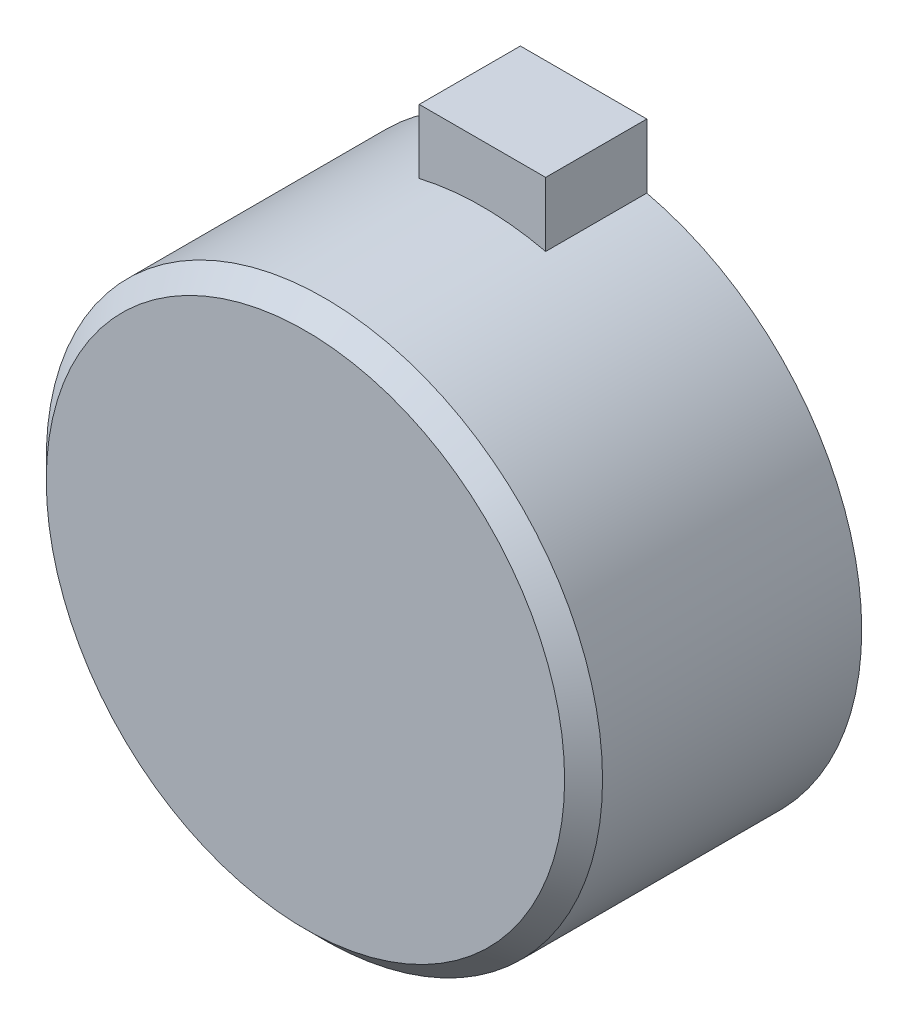
ISO-10303-21;
HEADER;
FILE_DESCRIPTION(('STEP AP214'),'2;1');
FILE_NAME('part.step','',(''),(''),'','','');
FILE_SCHEMA(('AUTOMOTIVE_DESIGN { 1 0 10303 214 1 1 1 1 }'));
ENDSEC;
DATA;
#1=APPLICATION_CONTEXT('core data for automotive mechanical design processes');
#2=APPLICATION_PROTOCOL_DEFINITION('international standard','automotive_design',2000,#1);
#3=PRODUCT_CONTEXT('',#1,'mechanical');
#4=PRODUCT('Part','Part','',(#3));
#5=PRODUCT_RELATED_PRODUCT_CATEGORY('part','',(#4));
#6=PRODUCT_DEFINITION_FORMATION('','',#4);
#7=PRODUCT_DEFINITION_CONTEXT('part definition',#1,'design');
#8=PRODUCT_DEFINITION('design','',#6,#7);
#9=PRODUCT_DEFINITION_SHAPE('','',#8);
#10=(LENGTH_UNIT() NAMED_UNIT(*) SI_UNIT(.MILLI.,.METRE.));
#11=(NAMED_UNIT(*) PLANE_ANGLE_UNIT() SI_UNIT($,.RADIAN.));
#12=(NAMED_UNIT(*) SI_UNIT($,.STERADIAN.) SOLID_ANGLE_UNIT());
#13=UNCERTAINTY_MEASURE_WITH_UNIT(LENGTH_MEASURE(1.E-05),#10,'distance_accuracy_value','');
#14=(GEOMETRIC_REPRESENTATION_CONTEXT(3) GLOBAL_UNCERTAINTY_ASSIGNED_CONTEXT((#13)) GLOBAL_UNIT_ASSIGNED_CONTEXT((#10,
#11,#12)) REPRESENTATION_CONTEXT('',''));
#15=CARTESIAN_POINT('',(0.,0.,0.));
#16=DIRECTION('',(0.,0.,1.));
#17=DIRECTION('',(1.,0.,0.));
#18=AXIS2_PLACEMENT_3D('',#15,#16,#17);
#19=CARTESIAN_POINT('',(0.,0.,10.));
#20=DIRECTION('',(0.,0.,1.));
#21=DIRECTION('',(1.,0.,0.));
#22=AXIS2_PLACEMENT_3D('',#19,#20,#21);
#23=CYLINDRICAL_SURFACE('',#22,44.);
#24=CARTESIAN_POINT('',(0.,0.,-3.));
#25=DIRECTION('',(0.,0.,1.));
#26=DIRECTION('',(1.,0.,0.));
#27=AXIS2_PLACEMENT_3D('',#24,#25,#26);
#28=CIRCLE('',#27,44.);
#29=CARTESIAN_POINT('',(44.,0.,-3.));
#30=VERTEX_POINT('',#29);
#31=EDGE_CURVE('E149',#30,#30,#28,.T.);
#32=ORIENTED_EDGE('',*,*,#31,.F.);
#33=EDGE_LOOP('',(#32));
#34=FACE_BOUND('',#33,.T.);
#35=CARTESIAN_POINT('',(0.,0.,-28.));
#36=DIRECTION('',(0.,0.,1.));
#37=DIRECTION('',(1.,0.,0.));
#38=AXIS2_PLACEMENT_3D('',#35,#36,#37);
#39=CIRCLE('',#38,44.);
#40=CARTESIAN_POINT('',(-10.,42.8485705712571,-28.));
#41=VERTEX_POINT('',#40);
#42=CARTESIAN_POINT('',(10.,42.8485705712571,-28.));
#43=VERTEX_POINT('',#42);
#44=EDGE_CURVE('E11',#41,#43,#39,.F.);
#45=ORIENTED_EDGE('',*,*,#44,.F.);
#46=DIRECTION('',(0.,0.,1.));
#47=VECTOR('',#46,1.);
#48=CARTESIAN_POINT('',(-10.,42.8485705712571,10.));
#49=LINE('',#48,#47);
#50=CARTESIAN_POINT('',(-10.,42.8485705712571,-44.));
#51=VERTEX_POINT('',#50);
#52=EDGE_CURVE('E57',#41,#51,#49,.F.);
#53=ORIENTED_EDGE('',*,*,#52,.T.);
#54=CARTESIAN_POINT('',(0.,0.,-44.));
#55=DIRECTION('',(0.,0.,1.));
#56=DIRECTION('',(1.,0.,0.));
#57=AXIS2_PLACEMENT_3D('',#54,#55,#56);
#58=CIRCLE('',#57,44.);
#59=CARTESIAN_POINT('',(10.,42.8485705712571,-44.));
#60=VERTEX_POINT('',#59);
#61=EDGE_CURVE('E144',#51,#60,#58,.T.);
#62=ORIENTED_EDGE('',*,*,#61,.T.);
#63=DIRECTION('',(0.,0.,1.));
#64=VECTOR('',#63,1.);
#65=CARTESIAN_POINT('',(10.,42.8485705712571,10.));
#66=LINE('',#65,#64);
#67=EDGE_CURVE('E91',#60,#43,#66,.T.);
#68=ORIENTED_EDGE('',*,*,#67,.T.);
#69=EDGE_LOOP('',(#45,#53,#62,#68));
#70=FACE_BOUND('',#69,.T.);
#71=ADVANCED_FACE('F39',(#34,#70),#23,.T.);
#72=CARTESIAN_POINT('',(0.,0.,0.));
#73=DIRECTION('',(0.,0.,1.));
#74=DIRECTION('',(1.,0.,0.));
#75=AXIS2_PLACEMENT_3D('',#72,#73,#74);
#76=PLANE('',#75);
#77=CARTESIAN_POINT('',(0.,0.,0.));
#78=DIRECTION('',(0.,0.,1.));
#79=DIRECTION('',(1.,0.,0.));
#80=AXIS2_PLACEMENT_3D('',#77,#78,#79);
#81=CIRCLE('',#80,41.);
#82=CARTESIAN_POINT('',(41.,0.,0.));
#83=VERTEX_POINT('',#82);
#84=EDGE_CURVE('E50',#83,#83,#81,.T.);
#85=ORIENTED_EDGE('',*,*,#84,.T.);
#86=EDGE_LOOP('',(#85));
#87=FACE_BOUND('',#86,.T.);
#88=ADVANCED_FACE('F41',(#87),#76,.T.);
#89=CARTESIAN_POINT('',(0.,0.,0.));
#90=DIRECTION('',(0.,0.,-1.));
#91=DIRECTION('',(-1.,0.,0.));
#92=AXIS2_PLACEMENT_3D('',#89,#90,#91);
#93=CONICAL_SURFACE('',#92,41.,0.785398163397449);
#94=ORIENTED_EDGE('',*,*,#31,.T.);
#95=EDGE_LOOP('',(#94));
#96=FACE_BOUND('',#95,.T.);
#97=ORIENTED_EDGE('',*,*,#84,.F.);
#98=EDGE_LOOP('',(#97));
#99=FACE_BOUND('',#98,.T.);
#100=ADVANCED_FACE('F154',(#96,#99),#93,.T.);
#101=CARTESIAN_POINT('',(41.,0.,-44.));
#102=DIRECTION('',(0.,0.,-1.));
#103=DIRECTION('',(-1.,0.,0.));
#104=AXIS2_PLACEMENT_3D('',#101,#102,#103);
#105=PLANE('',#104);
#106=ORIENTED_EDGE('',*,*,#61,.F.);
#107=DIRECTION('',(0.,-1.,0.));
#108=VECTOR('',#107,1.);
#109=CARTESIAN_POINT('',(-10.,53.,-44.));
#110=LINE('',#109,#108);
#111=CARTESIAN_POINT('',(-10.,53.,-44.));
#112=VERTEX_POINT('',#111);
#113=EDGE_CURVE('E103',#112,#51,#110,.T.);
#114=ORIENTED_EDGE('',*,*,#113,.F.);
#115=DIRECTION('',(-1.,0.,0.));
#116=VECTOR('',#115,1.);
#117=CARTESIAN_POINT('',(10.,53.,-44.));
#118=LINE('',#117,#116);
#119=CARTESIAN_POINT('',(10.,53.,-44.));
#120=VERTEX_POINT('',#119);
#121=EDGE_CURVE('E110',#120,#112,#118,.T.);
#122=ORIENTED_EDGE('',*,*,#121,.F.);
#123=DIRECTION('',(0.,1.,0.));
#124=VECTOR('',#123,1.);
#125=CARTESIAN_POINT('',(10.,40.,-44.));
#126=LINE('',#125,#124);
#127=EDGE_CURVE('E89',#60,#120,#126,.T.);
#128=ORIENTED_EDGE('',*,*,#127,.F.);
#129=EDGE_LOOP('',(#106,#114,#122,#128));
#130=FACE_BOUND('',#129,.T.);
#131=CARTESIAN_POINT('',(18.5,-32.0429399400242,-44.));
#132=DIRECTION('',(0.,0.,1.));
#133=DIRECTION('',(0.499999999999999,-0.866025403784439,0.));
#134=AXIS2_PLACEMENT_3D('',#131,#132,#133);
#135=CIRCLE('',#134,1.25);
#136=CARTESIAN_POINT('',(19.125,-33.1254716947548,-44.));
#137=VERTEX_POINT('',#136);
#138=EDGE_CURVE('E112',#137,#137,#135,.T.);
#139=ORIENTED_EDGE('',*,*,#138,.T.);
#140=EDGE_LOOP('',(#139));
#141=FACE_BOUND('',#140,.T.);
#142=CARTESIAN_POINT('',(-18.5,-32.0429399400242,-44.));
#143=DIRECTION('',(0.,0.,1.));
#144=DIRECTION('',(-0.5,-0.866025403784438,0.));
#145=AXIS2_PLACEMENT_3D('',#142,#143,#144);
#146=CIRCLE('',#145,1.25);
#147=CARTESIAN_POINT('',(-19.125,-33.1254716947548,-44.));
#148=VERTEX_POINT('',#147);
#149=EDGE_CURVE('E126',#148,#148,#146,.T.);
#150=ORIENTED_EDGE('',*,*,#149,.T.);
#151=EDGE_LOOP('',(#150));
#152=FACE_BOUND('',#151,.T.);
#153=CARTESIAN_POINT('',(-37.,0.,-44.));
#154=DIRECTION('',(0.,0.,1.));
#155=DIRECTION('',(-1.,0.,0.));
#156=AXIS2_PLACEMENT_3D('',#153,#154,#155);
#157=CIRCLE('',#156,1.25);
#158=CARTESIAN_POINT('',(-38.25,0.,-44.));
#159=VERTEX_POINT('',#158);
#160=EDGE_CURVE('E122',#159,#159,#157,.T.);
#161=ORIENTED_EDGE('',*,*,#160,.T.);
#162=EDGE_LOOP('',(#161));
#163=FACE_BOUND('',#162,.T.);
#164=CARTESIAN_POINT('',(-18.5,32.0429399400242,-44.));
#165=DIRECTION('',(0.,0.,1.));
#166=DIRECTION('',(-0.5,0.866025403784439,0.));
#167=AXIS2_PLACEMENT_3D('',#164,#165,#166);
#168=CIRCLE('',#167,1.25);
#169=CARTESIAN_POINT('',(-19.125,33.1254716947548,-44.));
#170=VERTEX_POINT('',#169);
#171=EDGE_CURVE('E119',#170,#170,#168,.T.);
#172=ORIENTED_EDGE('',*,*,#171,.T.);
#173=EDGE_LOOP('',(#172));
#174=FACE_BOUND('',#173,.T.);
#175=CARTESIAN_POINT('',(18.5,32.0429399400242,-44.));
#176=DIRECTION('',(0.,0.,1.));
#177=DIRECTION('',(0.5,0.866025403784439,0.));
#178=AXIS2_PLACEMENT_3D('',#175,#176,#177);
#179=CIRCLE('',#178,1.25);
#180=CARTESIAN_POINT('',(19.125,33.1254716947548,-44.));
#181=VERTEX_POINT('',#180);
#182=EDGE_CURVE('E113',#181,#181,#179,.T.);
#183=ORIENTED_EDGE('',*,*,#182,.T.);
#184=EDGE_LOOP('',(#183));
#185=FACE_BOUND('',#184,.T.);
#186=CARTESIAN_POINT('',(37.,0.,-44.));
#187=DIRECTION('',(0.,0.,1.));
#188=DIRECTION('',(1.,0.,0.));
#189=AXIS2_PLACEMENT_3D('',#186,#187,#188);
#190=CIRCLE('',#189,1.25);
#191=CARTESIAN_POINT('',(38.25,0.,-44.));
#192=VERTEX_POINT('',#191);
#193=EDGE_CURVE('E138',#192,#192,#190,.T.);
#194=ORIENTED_EDGE('',*,*,#193,.T.);
#195=EDGE_LOOP('',(#194));
#196=FACE_BOUND('',#195,.T.);
#197=ADVANCED_FACE('F160',(#130,#141,#152,#163,#174,#185,#196),#105,.T.);
#198=CARTESIAN_POINT('',(37.,0.,-36.));
#199=DIRECTION('',(0.,0.,-1.));
#200=DIRECTION('',(-1.,0.,0.));
#201=AXIS2_PLACEMENT_3D('',#198,#199,#200);
#202=CYLINDRICAL_SURFACE('',#201,1.25);
#203=CARTESIAN_POINT('',(37.,0.,-36.));
#204=DIRECTION('',(0.,0.,1.));
#205=DIRECTION('',(1.,0.,0.));
#206=AXIS2_PLACEMENT_3D('',#203,#204,#205);
#207=CIRCLE('',#206,1.25);
#208=CARTESIAN_POINT('',(38.25,0.,-36.));
#209=VERTEX_POINT('',#208);
#210=EDGE_CURVE('E142',#209,#209,#207,.T.);
#211=ORIENTED_EDGE('',*,*,#210,.T.);
#212=EDGE_LOOP('',(#211));
#213=FACE_BOUND('',#212,.T.);
#214=ORIENTED_EDGE('',*,*,#193,.F.);
#215=EDGE_LOOP('',(#214));
#216=FACE_BOUND('',#215,.T.);
#217=ADVANCED_FACE('F163',(#213,#216),#202,.F.);
#218=CARTESIAN_POINT('',(37.,0.,-36.));
#219=DIRECTION('',(0.,0.,1.));
#220=DIRECTION('',(1.,0.,0.));
#221=AXIS2_PLACEMENT_3D('',#218,#219,#220);
#222=PLANE('',#221);
#223=ORIENTED_EDGE('',*,*,#210,.F.);
#224=EDGE_LOOP('',(#223));
#225=FACE_BOUND('',#224,.T.);
#226=ADVANCED_FACE('F176',(#225),#222,.F.);
#227=CARTESIAN_POINT('',(18.5,32.0429399400242,-36.));
#228=DIRECTION('',(0.,0.,-1.));
#229=DIRECTION('',(-1.,0.,0.));
#230=AXIS2_PLACEMENT_3D('',#227,#228,#229);
#231=CYLINDRICAL_SURFACE('',#230,1.25);
#232=CARTESIAN_POINT('',(18.5,32.0429399400242,-36.));
#233=DIRECTION('',(0.,0.,1.));
#234=DIRECTION('',(0.5,0.866025403784439,0.));
#235=AXIS2_PLACEMENT_3D('',#232,#233,#234);
#236=CIRCLE('',#235,1.25);
#237=CARTESIAN_POINT('',(19.125,33.1254716947548,-36.));
#238=VERTEX_POINT('',#237);
#239=EDGE_CURVE('E136',#238,#238,#236,.T.);
#240=ORIENTED_EDGE('',*,*,#239,.T.);
#241=EDGE_LOOP('',(#240));
#242=FACE_BOUND('',#241,.T.);
#243=ORIENTED_EDGE('',*,*,#182,.F.);
#244=EDGE_LOOP('',(#243));
#245=FACE_BOUND('',#244,.T.);
#246=ADVANCED_FACE('F180',(#242,#245),#231,.F.);
#247=CARTESIAN_POINT('',(18.5,32.0429399400242,-36.));
#248=DIRECTION('',(0.,0.,1.));
#249=DIRECTION('',(0.5,0.866025403784439,0.));
#250=AXIS2_PLACEMENT_3D('',#247,#248,#249);
#251=PLANE('',#250);
#252=ORIENTED_EDGE('',*,*,#239,.F.);
#253=EDGE_LOOP('',(#252));
#254=FACE_BOUND('',#253,.T.);
#255=ADVANCED_FACE('F184',(#254),#251,.F.);
#256=CARTESIAN_POINT('',(-18.5,32.0429399400242,-36.));
#257=DIRECTION('',(0.,0.,-1.));
#258=DIRECTION('',(-1.,0.,0.));
#259=AXIS2_PLACEMENT_3D('',#256,#257,#258);
#260=CYLINDRICAL_SURFACE('',#259,1.25);
#261=CARTESIAN_POINT('',(-18.5,32.0429399400242,-36.));
#262=DIRECTION('',(0.,0.,1.));
#263=DIRECTION('',(-0.5,0.866025403784439,0.));
#264=AXIS2_PLACEMENT_3D('',#261,#262,#263);
#265=CIRCLE('',#264,1.25);
#266=CARTESIAN_POINT('',(-19.125,33.1254716947548,-36.));
#267=VERTEX_POINT('',#266);
#268=EDGE_CURVE('E115',#267,#267,#265,.T.);
#269=ORIENTED_EDGE('',*,*,#268,.T.);
#270=EDGE_LOOP('',(#269));
#271=FACE_BOUND('',#270,.T.);
#272=ORIENTED_EDGE('',*,*,#171,.F.);
#273=EDGE_LOOP('',(#272));
#274=FACE_BOUND('',#273,.T.);
#275=ADVANCED_FACE('F190',(#271,#274),#260,.F.);
#276=CARTESIAN_POINT('',(-18.5,32.0429399400242,-36.));
#277=DIRECTION('',(0.,0.,1.));
#278=DIRECTION('',(-0.5,0.866025403784439,0.));
#279=AXIS2_PLACEMENT_3D('',#276,#277,#278);
#280=PLANE('',#279);
#281=ORIENTED_EDGE('',*,*,#268,.F.);
#282=EDGE_LOOP('',(#281));
#283=FACE_BOUND('',#282,.T.);
#284=ADVANCED_FACE('F209',(#283),#280,.F.);
#285=CARTESIAN_POINT('',(-37.,0.,-36.));
#286=DIRECTION('',(0.,0.,-1.));
#287=DIRECTION('',(-1.,0.,0.));
#288=AXIS2_PLACEMENT_3D('',#285,#286,#287);
#289=CYLINDRICAL_SURFACE('',#288,1.25);
#290=CARTESIAN_POINT('',(-37.,0.,-36.));
#291=DIRECTION('',(0.,0.,1.));
#292=DIRECTION('',(-1.,0.,0.));
#293=AXIS2_PLACEMENT_3D('',#290,#291,#292);
#294=CIRCLE('',#293,1.25);
#295=CARTESIAN_POINT('',(-38.25,0.,-36.));
#296=VERTEX_POINT('',#295);
#297=EDGE_CURVE('E118',#296,#296,#294,.T.);
#298=ORIENTED_EDGE('',*,*,#297,.T.);
#299=EDGE_LOOP('',(#298));
#300=FACE_BOUND('',#299,.T.);
#301=ORIENTED_EDGE('',*,*,#160,.F.);
#302=EDGE_LOOP('',(#301));
#303=FACE_BOUND('',#302,.T.);
#304=ADVANCED_FACE('F210',(#300,#303),#289,.F.);
#305=CARTESIAN_POINT('',(-37.,0.,-36.));
#306=DIRECTION('',(0.,0.,1.));
#307=DIRECTION('',(-1.,0.,0.));
#308=AXIS2_PLACEMENT_3D('',#305,#306,#307);
#309=PLANE('',#308);
#310=ORIENTED_EDGE('',*,*,#297,.F.);
#311=EDGE_LOOP('',(#310));
#312=FACE_BOUND('',#311,.T.);
#313=ADVANCED_FACE('F205',(#312),#309,.F.);
#314=CARTESIAN_POINT('',(-18.5,-32.0429399400242,-36.));
#315=DIRECTION('',(0.,0.,-1.));
#316=DIRECTION('',(-1.,0.,0.));
#317=AXIS2_PLACEMENT_3D('',#314,#315,#316);
#318=CYLINDRICAL_SURFACE('',#317,1.25);
#319=CARTESIAN_POINT('',(-18.5,-32.0429399400242,-36.));
#320=DIRECTION('',(0.,0.,1.));
#321=DIRECTION('',(-0.5,-0.866025403784438,0.));
#322=AXIS2_PLACEMENT_3D('',#319,#320,#321);
#323=CIRCLE('',#322,1.25);
#324=CARTESIAN_POINT('',(-19.125,-33.1254716947548,-36.));
#325=VERTEX_POINT('',#324);
#326=EDGE_CURVE('E125',#325,#325,#323,.T.);
#327=ORIENTED_EDGE('',*,*,#326,.T.);
#328=EDGE_LOOP('',(#327));
#329=FACE_BOUND('',#328,.T.);
#330=ORIENTED_EDGE('',*,*,#149,.F.);
#331=EDGE_LOOP('',(#330));
#332=FACE_BOUND('',#331,.T.);
#333=ADVANCED_FACE('F200',(#329,#332),#318,.F.);
#334=CARTESIAN_POINT('',(-18.5,-32.0429399400242,-36.));
#335=DIRECTION('',(0.,0.,1.));
#336=DIRECTION('',(-0.5,-0.866025403784438,0.));
#337=AXIS2_PLACEMENT_3D('',#334,#335,#336);
#338=PLANE('',#337);
#339=ORIENTED_EDGE('',*,*,#326,.F.);
#340=EDGE_LOOP('',(#339));
#341=FACE_BOUND('',#340,.T.);
#342=ADVANCED_FACE('F193',(#341),#338,.F.);
#343=CARTESIAN_POINT('',(18.5,-32.0429399400242,-36.));
#344=DIRECTION('',(0.,0.,-1.));
#345=DIRECTION('',(-1.,0.,0.));
#346=AXIS2_PLACEMENT_3D('',#343,#344,#345);
#347=CYLINDRICAL_SURFACE('',#346,1.25);
#348=CARTESIAN_POINT('',(18.5,-32.0429399400242,-36.));
#349=DIRECTION('',(0.,0.,1.));
#350=DIRECTION('',(0.499999999999999,-0.866025403784439,0.));
#351=AXIS2_PLACEMENT_3D('',#348,#349,#350);
#352=CIRCLE('',#351,1.25);
#353=CARTESIAN_POINT('',(19.125,-33.1254716947548,-36.));
#354=VERTEX_POINT('',#353);
#355=EDGE_CURVE('E134',#354,#354,#352,.T.);
#356=ORIENTED_EDGE('',*,*,#355,.T.);
#357=EDGE_LOOP('',(#356));
#358=FACE_BOUND('',#357,.T.);
#359=ORIENTED_EDGE('',*,*,#138,.F.);
#360=EDGE_LOOP('',(#359));
#361=FACE_BOUND('',#360,.T.);
#362=ADVANCED_FACE('F187',(#358,#361),#347,.F.);
#363=CARTESIAN_POINT('',(18.5,-32.0429399400242,-36.));
#364=DIRECTION('',(0.,0.,1.));
#365=DIRECTION('',(0.499999999999999,-0.866025403784439,0.));
#366=AXIS2_PLACEMENT_3D('',#363,#364,#365);
#367=PLANE('',#366);
#368=ORIENTED_EDGE('',*,*,#355,.F.);
#369=EDGE_LOOP('',(#368));
#370=FACE_BOUND('',#369,.T.);
#371=ADVANCED_FACE('F194',(#370),#367,.F.);
#372=CARTESIAN_POINT('',(-10.,53.,-28.));
#373=DIRECTION('',(1.,0.,0.));
#374=DIRECTION('',(0.,0.,-1.));
#375=AXIS2_PLACEMENT_3D('',#372,#373,#374);
#376=PLANE('',#375);
#377=ORIENTED_EDGE('',*,*,#52,.F.);
#378=DIRECTION('',(0.,-1.,0.));
#379=VECTOR('',#378,1.);
#380=CARTESIAN_POINT('',(-10.,53.,-28.));
#381=LINE('',#380,#379);
#382=CARTESIAN_POINT('',(-10.,53.,-28.));
#383=VERTEX_POINT('',#382);
#384=EDGE_CURVE('E83',#383,#41,#381,.T.);
#385=ORIENTED_EDGE('',*,*,#384,.F.);
#386=DIRECTION('',(0.,0.,-1.));
#387=VECTOR('',#386,1.);
#388=CARTESIAN_POINT('',(-10.,53.,-28.));
#389=LINE('',#388,#387);
#390=EDGE_CURVE('E94',#383,#112,#389,.T.);
#391=ORIENTED_EDGE('',*,*,#390,.T.);
#392=ORIENTED_EDGE('',*,*,#113,.T.);
#393=EDGE_LOOP('',(#377,#385,#391,#392));
#394=FACE_BOUND('',#393,.T.);
#395=ADVANCED_FACE('F197',(#394),#376,.F.);
#396=CARTESIAN_POINT('',(10.,40.,-28.));
#397=DIRECTION('',(-1.,0.,0.));
#398=DIRECTION('',(0.,0.,1.));
#399=AXIS2_PLACEMENT_3D('',#396,#397,#398);
#400=PLANE('',#399);
#401=ORIENTED_EDGE('',*,*,#67,.F.);
#402=ORIENTED_EDGE('',*,*,#127,.T.);
#403=DIRECTION('',(0.,0.,-1.));
#404=VECTOR('',#403,1.);
#405=CARTESIAN_POINT('',(10.,53.,-28.));
#406=LINE('',#405,#404);
#407=CARTESIAN_POINT('',(10.,53.,-28.));
#408=VERTEX_POINT('',#407);
#409=EDGE_CURVE('E87',#408,#120,#406,.T.);
#410=ORIENTED_EDGE('',*,*,#409,.F.);
#411=DIRECTION('',(0.,1.,0.));
#412=VECTOR('',#411,1.);
#413=CARTESIAN_POINT('',(10.,40.,-28.));
#414=LINE('',#413,#412);
#415=EDGE_CURVE('E73',#43,#408,#414,.T.);
#416=ORIENTED_EDGE('',*,*,#415,.F.);
#417=EDGE_LOOP('',(#401,#402,#410,#416));
#418=FACE_BOUND('',#417,.T.);
#419=ADVANCED_FACE('F86',(#418),#400,.F.);
#420=CARTESIAN_POINT('',(10.,53.,-28.));
#421=DIRECTION('',(0.,-1.,0.));
#422=DIRECTION('',(0.,0.,-1.));
#423=AXIS2_PLACEMENT_3D('',#420,#421,#422);
#424=PLANE('',#423);
#425=ORIENTED_EDGE('',*,*,#121,.T.);
#426=ORIENTED_EDGE('',*,*,#390,.F.);
#427=DIRECTION('',(-1.,0.,0.));
#428=VECTOR('',#427,1.);
#429=CARTESIAN_POINT('',(10.,53.,-28.));
#430=LINE('',#429,#428);
#431=EDGE_CURVE('E77',#408,#383,#430,.T.);
#432=ORIENTED_EDGE('',*,*,#431,.F.);
#433=ORIENTED_EDGE('',*,*,#409,.T.);
#434=EDGE_LOOP('',(#425,#426,#432,#433));
#435=FACE_BOUND('',#434,.T.);
#436=ADVANCED_FACE('F96',(#435),#424,.F.);
#437=CARTESIAN_POINT('',(0.,0.,-28.));
#438=DIRECTION('',(0.,0.,1.));
#439=DIRECTION('',(1.,0.,0.));
#440=AXIS2_PLACEMENT_3D('',#437,#438,#439);
#441=PLANE('',#440);
#442=ORIENTED_EDGE('',*,*,#384,.T.);
#443=ORIENTED_EDGE('',*,*,#44,.T.);
#444=ORIENTED_EDGE('',*,*,#415,.T.);
#445=ORIENTED_EDGE('',*,*,#431,.T.);
#446=EDGE_LOOP('',(#442,#443,#444,#445));
#447=FACE_BOUND('',#446,.T.);
#448=ADVANCED_FACE('F80',(#447),#441,.T.);
#449=CLOSED_SHELL('',(#71,#88,#100,#197,#217,#226,#246,#255,#275,#284,#304,#313,#333,#342,#362,
#371,#395,#419,#436,#448));
#450=MANIFOLD_SOLID_BREP('B2',#449);
#451=ADVANCED_BREP_SHAPE_REPRESENTATION('',(#18,#450),#14);
#452=SHAPE_DEFINITION_REPRESENTATION(#9,#451);
ENDSEC;
END-ISO-10303-21;
